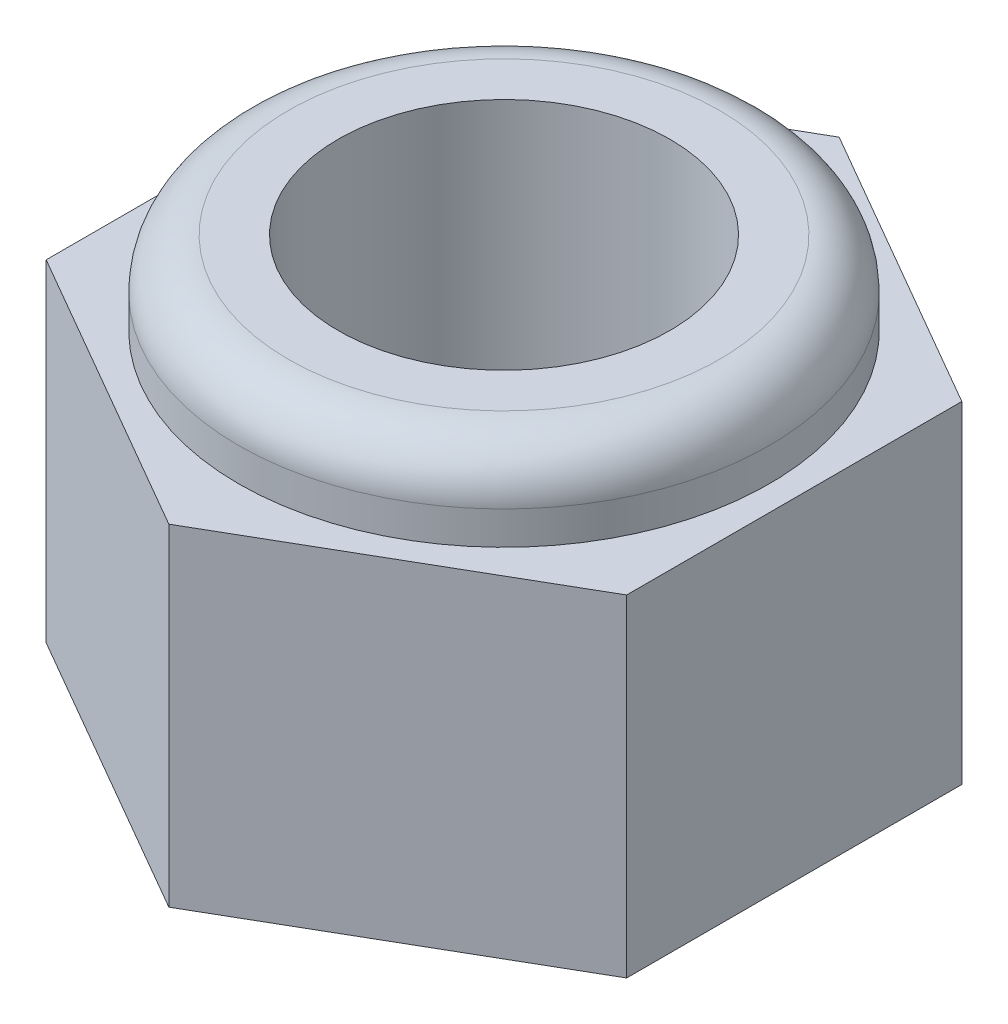
ISO-10303-21;
HEADER;
FILE_DESCRIPTION(('STEP AP214'),'2;1');
FILE_NAME('part.step','',(''),(''),'','','');
FILE_SCHEMA(('AUTOMOTIVE_DESIGN { 1 0 10303 214 1 1 1 1 }'));
ENDSEC;
DATA;
#1=APPLICATION_CONTEXT('core data for automotive mechanical design processes');
#2=APPLICATION_PROTOCOL_DEFINITION('international standard','automotive_design',2000,#1);
#3=PRODUCT_CONTEXT('',#1,'mechanical');
#4=PRODUCT('Part','Part','',(#3));
#5=PRODUCT_RELATED_PRODUCT_CATEGORY('part','',(#4));
#6=PRODUCT_DEFINITION_FORMATION('','',#4);
#7=PRODUCT_DEFINITION_CONTEXT('part definition',#1,'design');
#8=PRODUCT_DEFINITION('design','',#6,#7);
#9=PRODUCT_DEFINITION_SHAPE('','',#8);
#10=(LENGTH_UNIT() NAMED_UNIT(*) SI_UNIT(.MILLI.,.METRE.));
#11=(NAMED_UNIT(*) PLANE_ANGLE_UNIT() SI_UNIT($,.RADIAN.));
#12=(NAMED_UNIT(*) SI_UNIT($,.STERADIAN.) SOLID_ANGLE_UNIT());
#13=UNCERTAINTY_MEASURE_WITH_UNIT(LENGTH_MEASURE(1.E-05),#10,'distance_accuracy_value','');
#14=(GEOMETRIC_REPRESENTATION_CONTEXT(3) GLOBAL_UNCERTAINTY_ASSIGNED_CONTEXT((#13)) GLOBAL_UNIT_ASSIGNED_CONTEXT((#10,
#11,#12)) REPRESENTATION_CONTEXT('',''));
#15=CARTESIAN_POINT('',(0.,0.,0.));
#16=DIRECTION('',(0.,0.,1.));
#17=DIRECTION('',(1.,0.,0.));
#18=AXIS2_PLACEMENT_3D('',#15,#16,#17);
#19=CARTESIAN_POINT('',(3.49999999999998,4.,-2.02072594216373));
#20=DIRECTION('',(-0.499999999999995,0.,0.866025403784442));
#21=DIRECTION('',(0.866025403784442,0.,0.499999999999995));
#22=AXIS2_PLACEMENT_3D('',#19,#20,#21);
#23=PLANE('',#22);
#24=DIRECTION('',(-0.866025403784442,0.,-0.499999999999995));
#25=VECTOR('',#24,1.);
#26=CARTESIAN_POINT('',(3.49999999999998,0.,-2.02072594216373));
#27=LINE('',#26,#25);
#28=CARTESIAN_POINT('',(3.49999999999998,0.,-2.02072594216373));
#29=VERTEX_POINT('',#28);
#30=CARTESIAN_POINT('',(0.,0.,-4.04145188432738));
#31=VERTEX_POINT('',#30);
#32=EDGE_CURVE('E119',#29,#31,#27,.T.);
#33=ORIENTED_EDGE('',*,*,#32,.T.);
#34=DIRECTION('',(0.,-1.,0.));
#35=VECTOR('',#34,1.);
#36=CARTESIAN_POINT('',(0.,4.,-4.04145188432738));
#37=LINE('',#36,#35);
#38=CARTESIAN_POINT('',(0.,4.,-4.04145188432738));
#39=VERTEX_POINT('',#38);
#40=EDGE_CURVE('E11',#39,#31,#37,.T.);
#41=ORIENTED_EDGE('',*,*,#40,.F.);
#42=DIRECTION('',(-0.866025403784442,0.,-0.499999999999995));
#43=VECTOR('',#42,1.);
#44=CARTESIAN_POINT('',(3.49999999999998,4.,-2.02072594216373));
#45=LINE('',#44,#43);
#46=CARTESIAN_POINT('',(3.49999999999998,4.,-2.02072594216373));
#47=VERTEX_POINT('',#46);
#48=EDGE_CURVE('E130',#47,#39,#45,.T.);
#49=ORIENTED_EDGE('',*,*,#48,.F.);
#50=DIRECTION('',(0.,-1.,0.));
#51=VECTOR('',#50,1.);
#52=CARTESIAN_POINT('',(3.49999999999998,4.,-2.02072594216373));
#53=LINE('',#52,#51);
#54=EDGE_CURVE('E115',#47,#29,#53,.T.);
#55=ORIENTED_EDGE('',*,*,#54,.T.);
#56=EDGE_LOOP('',(#33,#41,#49,#55));
#57=FACE_BOUND('',#56,.T.);
#58=ADVANCED_FACE('F35',(#57),#23,.F.);
#59=CARTESIAN_POINT('',(0.,4.,-4.04145188432738));
#60=DIRECTION('',(0.500000000000001,0.,0.866025403784438));
#61=DIRECTION('',(0.866025403784438,0.,-0.500000000000001));
#62=AXIS2_PLACEMENT_3D('',#59,#60,#61);
#63=PLANE('',#62);
#64=DIRECTION('',(-0.866025403784438,0.,0.500000000000001));
#65=VECTOR('',#64,1.);
#66=CARTESIAN_POINT('',(0.,0.,-4.04145188432738));
#67=LINE('',#66,#65);
#68=CARTESIAN_POINT('',(-3.50000000000001,0.,-2.02072594216368));
#69=VERTEX_POINT('',#68);
#70=EDGE_CURVE('E122',#31,#69,#67,.T.);
#71=ORIENTED_EDGE('',*,*,#70,.T.);
#72=DIRECTION('',(0.,-1.,0.));
#73=VECTOR('',#72,1.);
#74=CARTESIAN_POINT('',(-3.50000000000001,4.,-2.02072594216368));
#75=LINE('',#74,#73);
#76=CARTESIAN_POINT('',(-3.50000000000001,4.,-2.02072594216368));
#77=VERTEX_POINT('',#76);
#78=EDGE_CURVE('E43',#77,#69,#75,.T.);
#79=ORIENTED_EDGE('',*,*,#78,.F.);
#80=DIRECTION('',(-0.866025403784438,0.,0.500000000000001));
#81=VECTOR('',#80,1.);
#82=CARTESIAN_POINT('',(0.,4.,-4.04145188432738));
#83=LINE('',#82,#81);
#84=EDGE_CURVE('E88',#39,#77,#83,.T.);
#85=ORIENTED_EDGE('',*,*,#84,.F.);
#86=ORIENTED_EDGE('',*,*,#40,.T.);
#87=EDGE_LOOP('',(#71,#79,#85,#86));
#88=FACE_BOUND('',#87,.T.);
#89=ADVANCED_FACE('F155',(#88),#63,.F.);
#90=CARTESIAN_POINT('',(-3.50000000000001,4.,-2.02072594216368));
#91=DIRECTION('',(1.,0.,0.));
#92=DIRECTION('',(0.,0.,-1.));
#93=AXIS2_PLACEMENT_3D('',#90,#91,#92);
#94=PLANE('',#93);
#95=DIRECTION('',(0.,0.,1.));
#96=VECTOR('',#95,1.);
#97=CARTESIAN_POINT('',(-3.50000000000001,0.,-2.02072594216368));
#98=LINE('',#97,#96);
#99=CARTESIAN_POINT('',(-3.49999999999999,0.,2.02072594216371));
#100=VERTEX_POINT('',#99);
#101=EDGE_CURVE('E125',#69,#100,#98,.T.);
#102=ORIENTED_EDGE('',*,*,#101,.T.);
#103=DIRECTION('',(0.,-1.,0.));
#104=VECTOR('',#103,1.);
#105=CARTESIAN_POINT('',(-3.49999999999999,4.,2.02072594216371));
#106=LINE('',#105,#104);
#107=CARTESIAN_POINT('',(-3.49999999999999,4.,2.02072594216371));
#108=VERTEX_POINT('',#107);
#109=EDGE_CURVE('E110',#108,#100,#106,.T.);
#110=ORIENTED_EDGE('',*,*,#109,.F.);
#111=DIRECTION('',(0.,0.,1.));
#112=VECTOR('',#111,1.);
#113=CARTESIAN_POINT('',(-3.50000000000001,4.,-2.02072594216368));
#114=LINE('',#113,#112);
#115=EDGE_CURVE('E101',#77,#108,#114,.T.);
#116=ORIENTED_EDGE('',*,*,#115,.F.);
#117=ORIENTED_EDGE('',*,*,#78,.T.);
#118=EDGE_LOOP('',(#102,#110,#116,#117));
#119=FACE_BOUND('',#118,.T.);
#120=ADVANCED_FACE('F136',(#119),#94,.F.);
#121=CARTESIAN_POINT('',(-3.49999999999999,4.,2.02072594216371));
#122=DIRECTION('',(0.499999999999995,0.,-0.866025403784441));
#123=DIRECTION('',(-0.866025403784442,0.,-0.499999999999995));
#124=AXIS2_PLACEMENT_3D('',#121,#122,#123);
#125=PLANE('',#124);
#126=DIRECTION('',(0.866025403784441,0.,0.499999999999995));
#127=VECTOR('',#126,1.);
#128=CARTESIAN_POINT('',(-3.49999999999999,0.,2.02072594216371));
#129=LINE('',#128,#127);
#130=CARTESIAN_POINT('',(0.,0.,4.04145188432738));
#131=VERTEX_POINT('',#130);
#132=EDGE_CURVE('E109',#100,#131,#129,.T.);
#133=ORIENTED_EDGE('',*,*,#132,.T.);
#134=DIRECTION('',(0.,-1.,0.));
#135=VECTOR('',#134,1.);
#136=CARTESIAN_POINT('',(0.,4.,4.04145188432738));
#137=LINE('',#136,#135);
#138=CARTESIAN_POINT('',(0.,4.,4.04145188432738));
#139=VERTEX_POINT('',#138);
#140=EDGE_CURVE('E106',#139,#131,#137,.T.);
#141=ORIENTED_EDGE('',*,*,#140,.F.);
#142=DIRECTION('',(0.866025403784441,0.,0.499999999999995));
#143=VECTOR('',#142,1.);
#144=CARTESIAN_POINT('',(-3.49999999999999,4.,2.02072594216371));
#145=LINE('',#144,#143);
#146=EDGE_CURVE('E95',#108,#139,#145,.T.);
#147=ORIENTED_EDGE('',*,*,#146,.F.);
#148=ORIENTED_EDGE('',*,*,#109,.T.);
#149=EDGE_LOOP('',(#133,#141,#147,#148));
#150=FACE_BOUND('',#149,.T.);
#151=ADVANCED_FACE('F107',(#150),#125,.F.);
#152=CARTESIAN_POINT('',(0.,4.,4.04145188432738));
#153=DIRECTION('',(-0.500000000000007,0.,-0.866025403784435));
#154=DIRECTION('',(-0.866025403784435,0.,0.500000000000007));
#155=AXIS2_PLACEMENT_3D('',#152,#153,#154);
#156=PLANE('',#155);
#157=DIRECTION('',(0.866025403784435,0.,-0.500000000000007));
#158=VECTOR('',#157,1.);
#159=CARTESIAN_POINT('',(0.,0.,4.04145188432738));
#160=LINE('',#159,#158);
#161=CARTESIAN_POINT('',(3.50000000000002,0.,2.02072594216366));
#162=VERTEX_POINT('',#161);
#163=EDGE_CURVE('E74',#131,#162,#160,.T.);
#164=ORIENTED_EDGE('',*,*,#163,.T.);
#165=DIRECTION('',(0.,-1.,0.));
#166=VECTOR('',#165,1.);
#167=CARTESIAN_POINT('',(3.50000000000002,4.,2.02072594216366));
#168=LINE('',#167,#166);
#169=CARTESIAN_POINT('',(3.50000000000002,4.,2.02072594216366));
#170=VERTEX_POINT('',#169);
#171=EDGE_CURVE('E111',#170,#162,#168,.T.);
#172=ORIENTED_EDGE('',*,*,#171,.F.);
#173=DIRECTION('',(0.866025403784435,0.,-0.500000000000007));
#174=VECTOR('',#173,1.);
#175=CARTESIAN_POINT('',(0.,4.,4.04145188432738));
#176=LINE('',#175,#174);
#177=EDGE_CURVE('E99',#139,#170,#176,.T.);
#178=ORIENTED_EDGE('',*,*,#177,.F.);
#179=ORIENTED_EDGE('',*,*,#140,.T.);
#180=EDGE_LOOP('',(#164,#172,#178,#179));
#181=FACE_BOUND('',#180,.T.);
#182=ADVANCED_FACE('F113',(#181),#156,.F.);
#183=CARTESIAN_POINT('',(3.50000000000002,4.,2.02072594216366));
#184=DIRECTION('',(-1.,0.,0.));
#185=DIRECTION('',(0.,0.,1.));
#186=AXIS2_PLACEMENT_3D('',#183,#184,#185);
#187=PLANE('',#186);
#188=DIRECTION('',(0.,0.,-1.));
#189=VECTOR('',#188,1.);
#190=CARTESIAN_POINT('',(3.50000000000002,0.,2.02072594216366));
#191=LINE('',#190,#189);
#192=EDGE_CURVE('E80',#162,#29,#191,.T.);
#193=ORIENTED_EDGE('',*,*,#192,.T.);
#194=ORIENTED_EDGE('',*,*,#54,.F.);
#195=DIRECTION('',(0.,0.,-1.));
#196=VECTOR('',#195,1.);
#197=CARTESIAN_POINT('',(3.50000000000002,4.,2.02072594216366));
#198=LINE('',#197,#196);
#199=EDGE_CURVE('E51',#170,#47,#198,.T.);
#200=ORIENTED_EDGE('',*,*,#199,.F.);
#201=ORIENTED_EDGE('',*,*,#171,.T.);
#202=EDGE_LOOP('',(#193,#194,#200,#201));
#203=FACE_BOUND('',#202,.T.);
#204=ADVANCED_FACE('F143',(#203),#187,.F.);
#205=CARTESIAN_POINT('',(0.,4.,0.));
#206=DIRECTION('',(0.,1.,0.));
#207=DIRECTION('',(0.,0.,1.));
#208=AXIS2_PLACEMENT_3D('',#205,#206,#207);
#209=PLANE('',#208);
#210=CARTESIAN_POINT('',(0.,4.,0.));
#211=DIRECTION('',(0.,-1.,0.));
#212=DIRECTION('',(0.,0.,-1.));
#213=AXIS2_PLACEMENT_3D('',#210,#211,#212);
#214=CIRCLE('',#213,3.2);
#215=CARTESIAN_POINT('',(0.,4.,-3.2));
#216=VERTEX_POINT('',#215);
#217=EDGE_CURVE('E123',#216,#216,#214,.T.);
#218=ORIENTED_EDGE('',*,*,#217,.T.);
#219=EDGE_LOOP('',(#218));
#220=FACE_BOUND('',#219,.T.);
#221=ORIENTED_EDGE('',*,*,#48,.T.);
#222=ORIENTED_EDGE('',*,*,#84,.T.);
#223=ORIENTED_EDGE('',*,*,#115,.T.);
#224=ORIENTED_EDGE('',*,*,#146,.T.);
#225=ORIENTED_EDGE('',*,*,#177,.T.);
#226=ORIENTED_EDGE('',*,*,#199,.T.);
#227=EDGE_LOOP('',(#221,#222,#223,#224,#225,#226));
#228=FACE_BOUND('',#227,.T.);
#229=ADVANCED_FACE('F97',(#220,#228),#209,.T.);
#230=CARTESIAN_POINT('',(0.,0.,0.));
#231=DIRECTION('',(0.,1.,0.));
#232=DIRECTION('',(0.,0.,1.));
#233=AXIS2_PLACEMENT_3D('',#230,#231,#232);
#234=PLANE('',#233);
#235=CARTESIAN_POINT('',(0.,0.,0.));
#236=DIRECTION('',(0.,-1.,0.));
#237=DIRECTION('',(0.,0.,-1.));
#238=AXIS2_PLACEMENT_3D('',#235,#236,#237);
#239=CIRCLE('',#238,2.);
#240=CARTESIAN_POINT('',(0.,0.,-2.));
#241=VERTEX_POINT('',#240);
#242=EDGE_CURVE('E238',#241,#241,#239,.T.);
#243=ORIENTED_EDGE('',*,*,#242,.F.);
#244=EDGE_LOOP('',(#243));
#245=FACE_BOUND('',#244,.T.);
#246=ORIENTED_EDGE('',*,*,#32,.F.);
#247=ORIENTED_EDGE('',*,*,#192,.F.);
#248=ORIENTED_EDGE('',*,*,#163,.F.);
#249=ORIENTED_EDGE('',*,*,#132,.F.);
#250=ORIENTED_EDGE('',*,*,#101,.F.);
#251=ORIENTED_EDGE('',*,*,#70,.F.);
#252=EDGE_LOOP('',(#246,#247,#248,#249,#250,#251));
#253=FACE_BOUND('',#252,.T.);
#254=ADVANCED_FACE('F139',(#245,#253),#234,.F.);
#255=CARTESIAN_POINT('',(0.,0.,0.));
#256=DIRECTION('',(0.,-1.,0.));
#257=DIRECTION('',(0.,0.,-1.));
#258=AXIS2_PLACEMENT_3D('',#255,#256,#257);
#259=CYLINDRICAL_SURFACE('',#258,3.2);
#260=ORIENTED_EDGE('',*,*,#217,.F.);
#261=EDGE_LOOP('',(#260));
#262=FACE_BOUND('',#261,.T.);
#263=CARTESIAN_POINT('',(0.,4.4,0.));
#264=DIRECTION('',(0.,-1.,0.));
#265=DIRECTION('',(0.,0.,-1.));
#266=AXIS2_PLACEMENT_3D('',#263,#264,#265);
#267=CIRCLE('',#266,3.2);
#268=CARTESIAN_POINT('',(0.,4.4,-3.2));
#269=VERTEX_POINT('',#268);
#270=EDGE_CURVE('E245',#269,#269,#267,.T.);
#271=ORIENTED_EDGE('',*,*,#270,.T.);
#272=EDGE_LOOP('',(#271));
#273=FACE_BOUND('',#272,.T.);
#274=ADVANCED_FACE('F190',(#262,#273),#259,.T.);
#275=CARTESIAN_POINT('',(0.,4.4,0.));
#276=DIRECTION('',(0.,-1.,0.));
#277=DIRECTION('',(0.,0.,-1.));
#278=AXIS2_PLACEMENT_3D('',#275,#276,#277);
#279=TOROIDAL_SURFACE('',#278,2.6,0.6);
#280=ORIENTED_EDGE('',*,*,#270,.F.);
#281=EDGE_LOOP('',(#280));
#282=FACE_BOUND('',#281,.T.);
#283=CARTESIAN_POINT('',(0.,5.,0.));
#284=DIRECTION('',(0.,-1.,0.));
#285=DIRECTION('',(0.,0.,-1.));
#286=AXIS2_PLACEMENT_3D('',#283,#284,#285);
#287=CIRCLE('',#286,2.6);
#288=CARTESIAN_POINT('',(0.,5.,-2.6));
#289=VERTEX_POINT('',#288);
#290=EDGE_CURVE('E242',#289,#289,#287,.T.);
#291=ORIENTED_EDGE('',*,*,#290,.T.);
#292=EDGE_LOOP('',(#291));
#293=FACE_BOUND('',#292,.T.);
#294=ADVANCED_FACE('F195',(#282,#293),#279,.T.);
#295=CARTESIAN_POINT('',(0.,5.,0.));
#296=DIRECTION('',(0.,-1.,0.));
#297=DIRECTION('',(0.,0.,-1.));
#298=AXIS2_PLACEMENT_3D('',#295,#296,#297);
#299=PLANE('',#298);
#300=CARTESIAN_POINT('',(0.,5.,0.));
#301=DIRECTION('',(0.,-1.,0.));
#302=DIRECTION('',(0.,0.,-1.));
#303=AXIS2_PLACEMENT_3D('',#300,#301,#302);
#304=CIRCLE('',#303,2.);
#305=CARTESIAN_POINT('',(0.,5.,-2.));
#306=VERTEX_POINT('',#305);
#307=EDGE_CURVE('E241',#306,#306,#304,.F.);
#308=ORIENTED_EDGE('',*,*,#307,.F.);
#309=EDGE_LOOP('',(#308));
#310=FACE_BOUND('',#309,.T.);
#311=ORIENTED_EDGE('',*,*,#290,.F.);
#312=EDGE_LOOP('',(#311));
#313=FACE_BOUND('',#312,.T.);
#314=ADVANCED_FACE('F205',(#310,#313),#299,.F.);
#315=CARTESIAN_POINT('',(0.,5.001,0.));
#316=DIRECTION('',(0.,-1.,0.));
#317=DIRECTION('',(0.,0.,-1.));
#318=AXIS2_PLACEMENT_3D('',#315,#316,#317);
#319=CYLINDRICAL_SURFACE('',#318,2.);
#320=ORIENTED_EDGE('',*,*,#242,.T.);
#321=EDGE_LOOP('',(#320));
#322=FACE_BOUND('',#321,.T.);
#323=ORIENTED_EDGE('',*,*,#307,.T.);
#324=EDGE_LOOP('',(#323));
#325=FACE_BOUND('',#324,.T.);
#326=ADVANCED_FACE('F221',(#322,#325),#319,.F.);
#327=CLOSED_SHELL('',(#58,#89,#120,#151,#182,#204,#229,#254,#274,#294,#314,#326));
#328=MANIFOLD_SOLID_BREP('B2',#327);
#329=ADVANCED_BREP_SHAPE_REPRESENTATION('',(#18,#328),#14);
#330=SHAPE_DEFINITION_REPRESENTATION(#9,#329);
ENDSEC;
END-ISO-10303-21;
